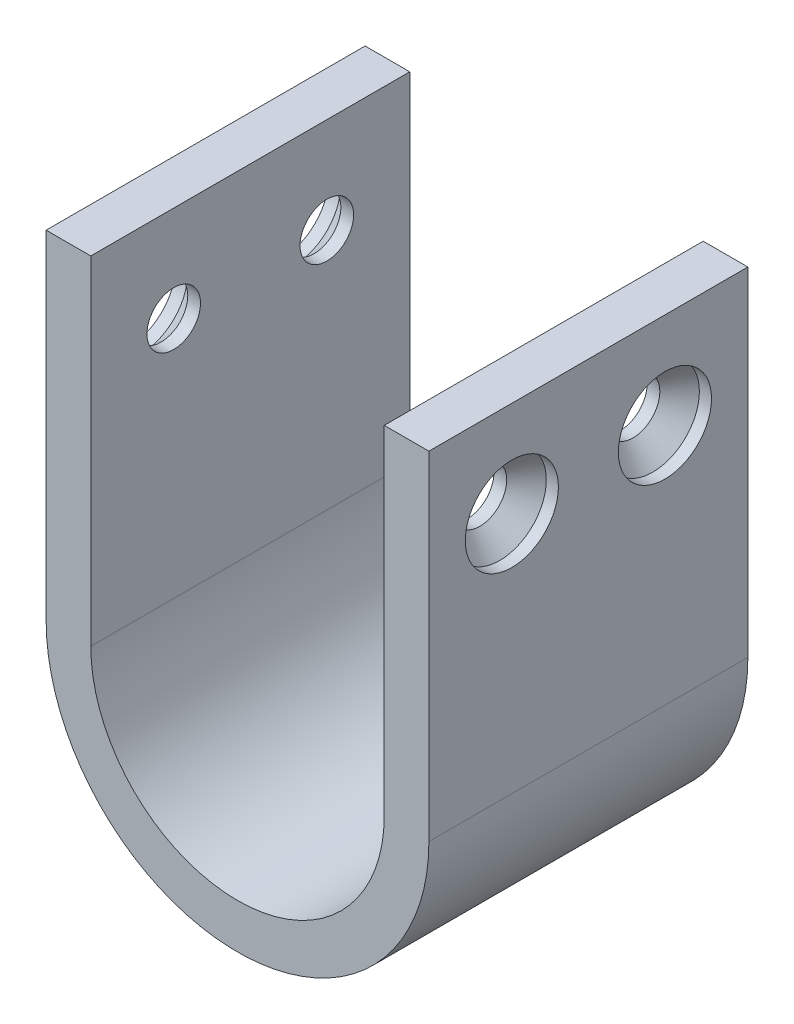
ISO-10303-21;
HEADER;
FILE_DESCRIPTION(('STEP AP214'),'2;1');
FILE_NAME('part.step','',(''),(''),'','','');
FILE_SCHEMA(('AUTOMOTIVE_DESIGN { 1 0 10303 214 1 1 1 1 }'));
ENDSEC;
DATA;
#1=APPLICATION_CONTEXT('core data for automotive mechanical design processes');
#2=APPLICATION_PROTOCOL_DEFINITION('international standard','automotive_design',2000,#1);
#3=PRODUCT_CONTEXT('',#1,'mechanical');
#4=PRODUCT('Part','Part','',(#3));
#5=PRODUCT_RELATED_PRODUCT_CATEGORY('part','',(#4));
#6=PRODUCT_DEFINITION_FORMATION('','',#4);
#7=PRODUCT_DEFINITION_CONTEXT('part definition',#1,'design');
#8=PRODUCT_DEFINITION('design','',#6,#7);
#9=PRODUCT_DEFINITION_SHAPE('','',#8);
#10=(LENGTH_UNIT() NAMED_UNIT(*) SI_UNIT(.MILLI.,.METRE.));
#11=(NAMED_UNIT(*) PLANE_ANGLE_UNIT() SI_UNIT($,.RADIAN.));
#12=(NAMED_UNIT(*) SI_UNIT($,.STERADIAN.) SOLID_ANGLE_UNIT());
#13=UNCERTAINTY_MEASURE_WITH_UNIT(LENGTH_MEASURE(1.E-05),#10,'distance_accuracy_value','');
#14=(GEOMETRIC_REPRESENTATION_CONTEXT(3) GLOBAL_UNCERTAINTY_ASSIGNED_CONTEXT((#13)) GLOBAL_UNIT_ASSIGNED_CONTEXT((#10,
#11,#12)) REPRESENTATION_CONTEXT('',''));
#15=CARTESIAN_POINT('',(0.,0.,0.));
#16=DIRECTION('',(0.,0.,1.));
#17=DIRECTION('',(1.,0.,0.));
#18=AXIS2_PLACEMENT_3D('',#15,#16,#17);
#19=CARTESIAN_POINT('',(15.,0.,25.));
#20=DIRECTION('',(-1.,0.,0.));
#21=DIRECTION('',(0.,-1.,0.));
#22=AXIS2_PLACEMENT_3D('',#19,#20,#21);
#23=PLANE('',#22);
#24=CARTESIAN_POINT('',(15.,19.,18.5));
#25=DIRECTION('',(-1.,0.,0.));
#26=DIRECTION('',(0.,0.,-1.));
#27=AXIS2_PLACEMENT_3D('',#24,#25,#26);
#28=CIRCLE('',#27,3.65);
#29=CARTESIAN_POINT('',(15.,19.,14.85));
#30=VERTEX_POINT('',#29);
#31=EDGE_CURVE('E300',#30,#30,#28,.T.);
#32=ORIENTED_EDGE('',*,*,#31,.T.);
#33=EDGE_LOOP('',(#32));
#34=FACE_BOUND('',#33,.T.);
#35=DIRECTION('',(0.,1.,0.));
#36=VECTOR('',#35,1.);
#37=CARTESIAN_POINT('',(15.,0.,0.));
#38=LINE('',#37,#36);
#39=CARTESIAN_POINT('',(15.,0.,0.));
#40=VERTEX_POINT('',#39);
#41=CARTESIAN_POINT('',(15.,26.5,0.));
#42=VERTEX_POINT('',#41);
#43=EDGE_CURVE('E127',#40,#42,#38,.T.);
#44=ORIENTED_EDGE('',*,*,#43,.T.);
#45=DIRECTION('',(0.,0.,-1.));
#46=VECTOR('',#45,1.);
#47=CARTESIAN_POINT('',(15.,26.5,25.));
#48=LINE('',#47,#46);
#49=CARTESIAN_POINT('',(15.,26.5,25.));
#50=VERTEX_POINT('',#49);
#51=EDGE_CURVE('E124',#50,#42,#48,.T.);
#52=ORIENTED_EDGE('',*,*,#51,.F.);
#53=DIRECTION('',(0.,1.,0.));
#54=VECTOR('',#53,1.);
#55=CARTESIAN_POINT('',(15.,0.,25.));
#56=LINE('',#55,#54);
#57=CARTESIAN_POINT('',(15.,0.,25.));
#58=VERTEX_POINT('',#57);
#59=EDGE_CURVE('E113',#58,#50,#56,.T.);
#60=ORIENTED_EDGE('',*,*,#59,.F.);
#61=DIRECTION('',(0.,0.,-1.));
#62=VECTOR('',#61,1.);
#63=CARTESIAN_POINT('',(15.,0.,25.));
#64=LINE('',#63,#62);
#65=EDGE_CURVE('E128',#58,#40,#64,.T.);
#66=ORIENTED_EDGE('',*,*,#65,.T.);
#67=EDGE_LOOP('',(#44,#52,#60,#66));
#68=FACE_BOUND('',#67,.T.);
#69=CARTESIAN_POINT('',(15.,19.,6.5));
#70=DIRECTION('',(-1.,0.,0.));
#71=DIRECTION('',(0.,0.,1.));
#72=AXIS2_PLACEMENT_3D('',#69,#70,#71);
#73=CIRCLE('',#72,3.65);
#74=CARTESIAN_POINT('',(15.,19.,10.15));
#75=VERTEX_POINT('',#74);
#76=EDGE_CURVE('E297',#75,#75,#73,.T.);
#77=ORIENTED_EDGE('',*,*,#76,.T.);
#78=EDGE_LOOP('',(#77));
#79=FACE_BOUND('',#78,.T.);
#80=ADVANCED_FACE('F39',(#34,#68,#79),#23,.F.);
#81=CARTESIAN_POINT('',(-15.001,19.,6.5));
#82=DIRECTION('',(1.,0.,0.));
#83=DIRECTION('',(0.,0.,-1.));
#84=AXIS2_PLACEMENT_3D('',#81,#82,#83);
#85=CYLINDRICAL_SURFACE('',#84,2.1);
#86=CARTESIAN_POINT('',(12.5,19.,6.5));
#87=DIRECTION('',(1.,0.,0.));
#88=DIRECTION('',(0.,0.,-1.));
#89=AXIS2_PLACEMENT_3D('',#86,#87,#88);
#90=CIRCLE('',#89,2.1);
#91=CARTESIAN_POINT('',(12.5,19.,4.4));
#92=VERTEX_POINT('',#91);
#93=EDGE_CURVE('E182',#92,#92,#90,.T.);
#94=ORIENTED_EDGE('',*,*,#93,.T.);
#95=EDGE_LOOP('',(#94));
#96=FACE_BOUND('',#95,.T.);
#97=CARTESIAN_POINT('',(11.5,19.,6.5));
#98=DIRECTION('',(1.,0.,0.));
#99=DIRECTION('',(0.,1.,0.));
#100=AXIS2_PLACEMENT_3D('',#97,#98,#99);
#101=CIRCLE('',#100,2.1);
#102=CARTESIAN_POINT('',(11.5,21.1,6.5));
#103=VERTEX_POINT('',#102);
#104=EDGE_CURVE('E291',#103,#103,#101,.T.);
#105=ORIENTED_EDGE('',*,*,#104,.F.);
#106=EDGE_LOOP('',(#105));
#107=FACE_BOUND('',#106,.T.);
#108=ADVANCED_FACE('F203',(#96,#107),#85,.F.);
#109=CARTESIAN_POINT('',(11.5,0.,25.));
#110=DIRECTION('',(1.,0.,0.));
#111=DIRECTION('',(0.,1.,0.));
#112=AXIS2_PLACEMENT_3D('',#109,#110,#111);
#113=PLANE('',#112);
#114=CARTESIAN_POINT('',(11.5,19.,18.5));
#115=DIRECTION('',(1.,0.,0.));
#116=DIRECTION('',(0.,1.,0.));
#117=AXIS2_PLACEMENT_3D('',#114,#115,#116);
#118=CIRCLE('',#117,2.1);
#119=CARTESIAN_POINT('',(11.5,21.1,18.5));
#120=VERTEX_POINT('',#119);
#121=EDGE_CURVE('E293',#120,#120,#118,.F.);
#122=ORIENTED_EDGE('',*,*,#121,.F.);
#123=EDGE_LOOP('',(#122));
#124=FACE_BOUND('',#123,.T.);
#125=DIRECTION('',(0.,-1.,0.));
#126=VECTOR('',#125,1.);
#127=CARTESIAN_POINT('',(11.5,0.,0.));
#128=LINE('',#127,#126);
#129=CARTESIAN_POINT('',(11.5,26.5,0.));
#130=VERTEX_POINT('',#129);
#131=CARTESIAN_POINT('',(11.5,0.,0.));
#132=VERTEX_POINT('',#131);
#133=EDGE_CURVE('E91',#130,#132,#128,.T.);
#134=ORIENTED_EDGE('',*,*,#133,.T.);
#135=DIRECTION('',(0.,0.,-1.));
#136=VECTOR('',#135,1.);
#137=CARTESIAN_POINT('',(11.5,0.,25.));
#138=LINE('',#137,#136);
#139=CARTESIAN_POINT('',(11.5,0.,25.));
#140=VERTEX_POINT('',#139);
#141=EDGE_CURVE('E133',#140,#132,#138,.T.);
#142=ORIENTED_EDGE('',*,*,#141,.F.);
#143=DIRECTION('',(0.,-1.,0.));
#144=VECTOR('',#143,1.);
#145=CARTESIAN_POINT('',(11.5,0.,25.));
#146=LINE('',#145,#144);
#147=CARTESIAN_POINT('',(11.5,26.5,25.));
#148=VERTEX_POINT('',#147);
#149=EDGE_CURVE('E56',#148,#140,#146,.T.);
#150=ORIENTED_EDGE('',*,*,#149,.F.);
#151=DIRECTION('',(0.,0.,-1.));
#152=VECTOR('',#151,1.);
#153=CARTESIAN_POINT('',(11.5,26.5,25.));
#154=LINE('',#153,#152);
#155=EDGE_CURVE('E129',#148,#130,#154,.T.);
#156=ORIENTED_EDGE('',*,*,#155,.T.);
#157=EDGE_LOOP('',(#134,#142,#150,#156));
#158=FACE_BOUND('',#157,.T.);
#159=ORIENTED_EDGE('',*,*,#104,.T.);
#160=EDGE_LOOP('',(#159));
#161=FACE_BOUND('',#160,.T.);
#162=ADVANCED_FACE('F209',(#124,#158,#161),#113,.F.);
#163=CARTESIAN_POINT('',(15.001,19.,6.5));
#164=DIRECTION('',(-1.,0.,0.));
#165=DIRECTION('',(0.,0.,1.));
#166=AXIS2_PLACEMENT_3D('',#163,#164,#165);
#167=CYLINDRICAL_SURFACE('',#166,2.1);
#168=CARTESIAN_POINT('',(-12.5,19.,6.5));
#169=DIRECTION('',(-1.,0.,0.));
#170=DIRECTION('',(0.,0.,1.));
#171=AXIS2_PLACEMENT_3D('',#168,#169,#170);
#172=CIRCLE('',#171,2.1);
#173=CARTESIAN_POINT('',(-12.5,19.,8.6));
#174=VERTEX_POINT('',#173);
#175=EDGE_CURVE('E170',#174,#174,#172,.T.);
#176=ORIENTED_EDGE('',*,*,#175,.T.);
#177=EDGE_LOOP('',(#176));
#178=FACE_BOUND('',#177,.T.);
#179=CARTESIAN_POINT('',(-11.5,19.,6.5));
#180=DIRECTION('',(-1.,0.,0.));
#181=DIRECTION('',(0.,0.,1.));
#182=AXIS2_PLACEMENT_3D('',#179,#180,#181);
#183=CIRCLE('',#182,2.1);
#184=CARTESIAN_POINT('',(-11.5,19.,8.6));
#185=VERTEX_POINT('',#184);
#186=EDGE_CURVE('E141',#185,#185,#183,.F.);
#187=ORIENTED_EDGE('',*,*,#186,.T.);
#188=EDGE_LOOP('',(#187));
#189=FACE_BOUND('',#188,.T.);
#190=ADVANCED_FACE('F232',(#178,#189),#167,.F.);
#191=CARTESIAN_POINT('',(-11.5,0.,25.));
#192=DIRECTION('',(-1.,0.,0.));
#193=DIRECTION('',(0.,0.,1.));
#194=AXIS2_PLACEMENT_3D('',#191,#192,#193);
#195=PLANE('',#194);
#196=DIRECTION('',(0.,1.,0.));
#197=VECTOR('',#196,1.);
#198=CARTESIAN_POINT('',(-11.5,0.,0.));
#199=LINE('',#198,#197);
#200=CARTESIAN_POINT('',(-11.5,0.,0.));
#201=VERTEX_POINT('',#200);
#202=CARTESIAN_POINT('',(-11.5,26.5,0.));
#203=VERTEX_POINT('',#202);
#204=EDGE_CURVE('E140',#201,#203,#199,.T.);
#205=ORIENTED_EDGE('',*,*,#204,.T.);
#206=DIRECTION('',(0.,0.,-1.));
#207=VECTOR('',#206,1.);
#208=CARTESIAN_POINT('',(-11.5,26.5,25.));
#209=LINE('',#208,#207);
#210=CARTESIAN_POINT('',(-11.5,26.5,25.));
#211=VERTEX_POINT('',#210);
#212=EDGE_CURVE('E162',#211,#203,#209,.T.);
#213=ORIENTED_EDGE('',*,*,#212,.F.);
#214=DIRECTION('',(0.,1.,0.));
#215=VECTOR('',#214,1.);
#216=CARTESIAN_POINT('',(-11.5,0.,25.));
#217=LINE('',#216,#215);
#218=CARTESIAN_POINT('',(-11.5,0.,25.));
#219=VERTEX_POINT('',#218);
#220=EDGE_CURVE('E100',#219,#211,#217,.T.);
#221=ORIENTED_EDGE('',*,*,#220,.F.);
#222=DIRECTION('',(0.,0.,-1.));
#223=VECTOR('',#222,1.);
#224=CARTESIAN_POINT('',(-11.5,0.,25.));
#225=LINE('',#224,#223);
#226=EDGE_CURVE('E165',#219,#201,#225,.T.);
#227=ORIENTED_EDGE('',*,*,#226,.T.);
#228=EDGE_LOOP('',(#205,#213,#221,#227));
#229=FACE_BOUND('',#228,.T.);
#230=CARTESIAN_POINT('',(-11.5,19.,18.5));
#231=DIRECTION('',(-1.,0.,0.));
#232=DIRECTION('',(0.,0.,1.));
#233=AXIS2_PLACEMENT_3D('',#230,#231,#232);
#234=CIRCLE('',#233,2.1);
#235=CARTESIAN_POINT('',(-11.5,19.,20.6));
#236=VERTEX_POINT('',#235);
#237=EDGE_CURVE('E259',#236,#236,#234,.T.);
#238=ORIENTED_EDGE('',*,*,#237,.T.);
#239=EDGE_LOOP('',(#238));
#240=FACE_BOUND('',#239,.T.);
#241=ORIENTED_EDGE('',*,*,#186,.F.);
#242=EDGE_LOOP('',(#241));
#243=FACE_BOUND('',#242,.T.);
#244=ADVANCED_FACE('F225',(#229,#240,#243),#195,.F.);
#245=CARTESIAN_POINT('',(-15.,0.,25.));
#246=DIRECTION('',(1.,0.,0.));
#247=DIRECTION('',(0.,0.,-1.));
#248=AXIS2_PLACEMENT_3D('',#245,#246,#247);
#249=PLANE('',#248);
#250=CARTESIAN_POINT('',(-15.,19.,6.5));
#251=DIRECTION('',(-1.,0.,0.));
#252=DIRECTION('',(0.,0.,1.));
#253=AXIS2_PLACEMENT_3D('',#250,#251,#252);
#254=CIRCLE('',#253,3.65);
#255=CARTESIAN_POINT('',(-15.,19.,10.15));
#256=VERTEX_POINT('',#255);
#257=EDGE_CURVE('E262',#256,#256,#254,.T.);
#258=ORIENTED_EDGE('',*,*,#257,.F.);
#259=EDGE_LOOP('',(#258));
#260=FACE_BOUND('',#259,.T.);
#261=CARTESIAN_POINT('',(-15.,19.,18.5));
#262=DIRECTION('',(-1.,0.,0.));
#263=DIRECTION('',(0.,0.,-1.));
#264=AXIS2_PLACEMENT_3D('',#261,#262,#263);
#265=CIRCLE('',#264,3.65);
#266=CARTESIAN_POINT('',(-15.,19.,14.85));
#267=VERTEX_POINT('',#266);
#268=EDGE_CURVE('E265',#267,#267,#265,.T.);
#269=ORIENTED_EDGE('',*,*,#268,.F.);
#270=EDGE_LOOP('',(#269));
#271=FACE_BOUND('',#270,.T.);
#272=DIRECTION('',(0.,-1.,0.));
#273=VECTOR('',#272,1.);
#274=CARTESIAN_POINT('',(-15.,0.,0.));
#275=LINE('',#274,#273);
#276=CARTESIAN_POINT('',(-15.,26.5,0.));
#277=VERTEX_POINT('',#276);
#278=CARTESIAN_POINT('',(-15.,0.,0.));
#279=VERTEX_POINT('',#278);
#280=EDGE_CURVE('E145',#277,#279,#275,.T.);
#281=ORIENTED_EDGE('',*,*,#280,.T.);
#282=DIRECTION('',(0.,0.,-1.));
#283=VECTOR('',#282,1.);
#284=CARTESIAN_POINT('',(-15.,0.,25.));
#285=LINE('',#284,#283);
#286=CARTESIAN_POINT('',(-15.,0.,25.));
#287=VERTEX_POINT('',#286);
#288=EDGE_CURVE('E156',#287,#279,#285,.T.);
#289=ORIENTED_EDGE('',*,*,#288,.F.);
#290=DIRECTION('',(0.,-1.,0.));
#291=VECTOR('',#290,1.);
#292=CARTESIAN_POINT('',(-15.,0.,25.));
#293=LINE('',#292,#291);
#294=CARTESIAN_POINT('',(-15.,26.5,25.));
#295=VERTEX_POINT('',#294);
#296=EDGE_CURVE('E272',#295,#287,#293,.T.);
#297=ORIENTED_EDGE('',*,*,#296,.F.);
#298=DIRECTION('',(0.,0.,-1.));
#299=VECTOR('',#298,1.);
#300=CARTESIAN_POINT('',(-15.,26.5,25.));
#301=LINE('',#300,#299);
#302=EDGE_CURVE('E159',#295,#277,#301,.T.);
#303=ORIENTED_EDGE('',*,*,#302,.T.);
#304=EDGE_LOOP('',(#281,#289,#297,#303));
#305=FACE_BOUND('',#304,.T.);
#306=ADVANCED_FACE('F221',(#260,#271,#305),#249,.F.);
#307=CARTESIAN_POINT('',(0.,0.,25.));
#308=DIRECTION('',(0.,0.,-1.));
#309=DIRECTION('',(-1.,0.,0.));
#310=AXIS2_PLACEMENT_3D('',#307,#308,#309);
#311=CYLINDRICAL_SURFACE('',#310,11.5);
#312=CARTESIAN_POINT('',(0.,0.,0.));
#313=DIRECTION('',(0.,0.,-1.));
#314=DIRECTION('',(1.,0.,0.));
#315=AXIS2_PLACEMENT_3D('',#312,#313,#314);
#316=CIRCLE('',#315,11.5);
#317=EDGE_CURVE('E137',#132,#201,#316,.T.);
#318=ORIENTED_EDGE('',*,*,#317,.T.);
#319=ORIENTED_EDGE('',*,*,#226,.F.);
#320=CARTESIAN_POINT('',(0.,0.,25.));
#321=DIRECTION('',(0.,0.,-1.));
#322=DIRECTION('',(1.,0.,0.));
#323=AXIS2_PLACEMENT_3D('',#320,#321,#322);
#324=CIRCLE('',#323,11.5);
#325=EDGE_CURVE('E152',#140,#219,#324,.T.);
#326=ORIENTED_EDGE('',*,*,#325,.F.);
#327=ORIENTED_EDGE('',*,*,#141,.T.);
#328=EDGE_LOOP('',(#318,#319,#326,#327));
#329=FACE_BOUND('',#328,.T.);
#330=ADVANCED_FACE('F224',(#329),#311,.F.);
#331=CARTESIAN_POINT('',(-15.,26.5,25.));
#332=DIRECTION('',(0.,-1.,0.));
#333=DIRECTION('',(0.,0.,-1.));
#334=AXIS2_PLACEMENT_3D('',#331,#332,#333);
#335=PLANE('',#334);
#336=DIRECTION('',(-1.,0.,0.));
#337=VECTOR('',#336,1.);
#338=CARTESIAN_POINT('',(-15.,26.5,0.));
#339=LINE('',#338,#337);
#340=EDGE_CURVE('E143',#203,#277,#339,.T.);
#341=ORIENTED_EDGE('',*,*,#340,.T.);
#342=ORIENTED_EDGE('',*,*,#302,.F.);
#343=DIRECTION('',(-1.,0.,0.));
#344=VECTOR('',#343,1.);
#345=CARTESIAN_POINT('',(-15.,26.5,25.));
#346=LINE('',#345,#344);
#347=EDGE_CURVE('E270',#211,#295,#346,.T.);
#348=ORIENTED_EDGE('',*,*,#347,.F.);
#349=ORIENTED_EDGE('',*,*,#212,.T.);
#350=EDGE_LOOP('',(#341,#342,#348,#349));
#351=FACE_BOUND('',#350,.T.);
#352=ADVANCED_FACE('F219',(#351),#335,.F.);
#353=CARTESIAN_POINT('',(0.,0.,25.));
#354=DIRECTION('',(0.,0.,-1.));
#355=DIRECTION('',(-1.,0.,0.));
#356=AXIS2_PLACEMENT_3D('',#353,#354,#355);
#357=CYLINDRICAL_SURFACE('',#356,15.);
#358=CARTESIAN_POINT('',(0.,0.,0.));
#359=DIRECTION('',(0.,0.,1.));
#360=DIRECTION('',(1.,0.,0.));
#361=AXIS2_PLACEMENT_3D('',#358,#359,#360);
#362=CIRCLE('',#361,15.);
#363=EDGE_CURVE('E147',#279,#40,#362,.T.);
#364=ORIENTED_EDGE('',*,*,#363,.T.);
#365=ORIENTED_EDGE('',*,*,#65,.F.);
#366=CARTESIAN_POINT('',(0.,0.,25.));
#367=DIRECTION('',(0.,0.,1.));
#368=DIRECTION('',(1.,0.,0.));
#369=AXIS2_PLACEMENT_3D('',#366,#367,#368);
#370=CIRCLE('',#369,15.);
#371=EDGE_CURVE('E119',#287,#58,#370,.T.);
#372=ORIENTED_EDGE('',*,*,#371,.F.);
#373=ORIENTED_EDGE('',*,*,#288,.T.);
#374=EDGE_LOOP('',(#364,#365,#372,#373));
#375=FACE_BOUND('',#374,.T.);
#376=ADVANCED_FACE('F216',(#375),#357,.T.);
#377=CARTESIAN_POINT('',(15.,26.5,25.));
#378=DIRECTION('',(0.,-1.,0.));
#379=DIRECTION('',(1.,0.,0.));
#380=AXIS2_PLACEMENT_3D('',#377,#378,#379);
#381=PLANE('',#380);
#382=DIRECTION('',(-1.,0.,0.));
#383=VECTOR('',#382,1.);
#384=CARTESIAN_POINT('',(15.,26.5,0.));
#385=LINE('',#384,#383);
#386=EDGE_CURVE('E85',#42,#130,#385,.T.);
#387=ORIENTED_EDGE('',*,*,#386,.T.);
#388=ORIENTED_EDGE('',*,*,#155,.F.);
#389=DIRECTION('',(-1.,0.,0.));
#390=VECTOR('',#389,1.);
#391=CARTESIAN_POINT('',(15.,26.5,25.));
#392=LINE('',#391,#390);
#393=EDGE_CURVE('E117',#50,#148,#392,.T.);
#394=ORIENTED_EDGE('',*,*,#393,.F.);
#395=ORIENTED_EDGE('',*,*,#51,.T.);
#396=EDGE_LOOP('',(#387,#388,#394,#395));
#397=FACE_BOUND('',#396,.T.);
#398=ADVANCED_FACE('F131',(#397),#381,.F.);
#399=CARTESIAN_POINT('',(0.,0.,25.));
#400=DIRECTION('',(0.,0.,1.));
#401=DIRECTION('',(1.,0.,0.));
#402=AXIS2_PLACEMENT_3D('',#399,#400,#401);
#403=PLANE('',#402);
#404=ORIENTED_EDGE('',*,*,#325,.T.);
#405=ORIENTED_EDGE('',*,*,#220,.T.);
#406=ORIENTED_EDGE('',*,*,#347,.T.);
#407=ORIENTED_EDGE('',*,*,#296,.T.);
#408=ORIENTED_EDGE('',*,*,#371,.T.);
#409=ORIENTED_EDGE('',*,*,#59,.T.);
#410=ORIENTED_EDGE('',*,*,#393,.T.);
#411=ORIENTED_EDGE('',*,*,#149,.T.);
#412=EDGE_LOOP('',(#404,#405,#406,#407,#408,#409,#410,#411));
#413=FACE_BOUND('',#412,.T.);
#414=ADVANCED_FACE('F115',(#413),#403,.T.);
#415=CARTESIAN_POINT('',(0.,0.,0.));
#416=DIRECTION('',(0.,0.,1.));
#417=DIRECTION('',(1.,0.,0.));
#418=AXIS2_PLACEMENT_3D('',#415,#416,#417);
#419=PLANE('',#418);
#420=ORIENTED_EDGE('',*,*,#317,.F.);
#421=ORIENTED_EDGE('',*,*,#133,.F.);
#422=ORIENTED_EDGE('',*,*,#386,.F.);
#423=ORIENTED_EDGE('',*,*,#43,.F.);
#424=ORIENTED_EDGE('',*,*,#363,.F.);
#425=ORIENTED_EDGE('',*,*,#280,.F.);
#426=ORIENTED_EDGE('',*,*,#340,.F.);
#427=ORIENTED_EDGE('',*,*,#204,.F.);
#428=EDGE_LOOP('',(#420,#421,#422,#423,#424,#425,#426,#427));
#429=FACE_BOUND('',#428,.T.);
#430=ADVANCED_FACE('F282',(#429),#419,.F.);
#431=CARTESIAN_POINT('',(15.001,19.,18.5));
#432=DIRECTION('',(-1.,0.,0.));
#433=DIRECTION('',(0.,0.,1.));
#434=AXIS2_PLACEMENT_3D('',#431,#432,#433);
#435=CYLINDRICAL_SURFACE('',#434,2.1);
#436=CARTESIAN_POINT('',(-12.5,19.,18.5));
#437=DIRECTION('',(1.,0.,0.));
#438=DIRECTION('',(0.,0.,-1.));
#439=AXIS2_PLACEMENT_3D('',#436,#437,#438);
#440=CIRCLE('',#439,2.1);
#441=CARTESIAN_POINT('',(-12.5,19.,16.4));
#442=VERTEX_POINT('',#441);
#443=EDGE_CURVE('E167',#442,#442,#440,.F.);
#444=ORIENTED_EDGE('',*,*,#443,.T.);
#445=EDGE_LOOP('',(#444));
#446=FACE_BOUND('',#445,.T.);
#447=ORIENTED_EDGE('',*,*,#237,.F.);
#448=EDGE_LOOP('',(#447));
#449=FACE_BOUND('',#448,.T.);
#450=ADVANCED_FACE('F315',(#446,#449),#435,.F.);
#451=CARTESIAN_POINT('',(-14.5,19.,6.5));
#452=DIRECTION('',(-1.,0.,0.));
#453=DIRECTION('',(0.,0.,1.));
#454=AXIS2_PLACEMENT_3D('',#451,#452,#453);
#455=CYLINDRICAL_SURFACE('',#454,3.65);
#456=CARTESIAN_POINT('',(-14.05,19.,6.5));
#457=DIRECTION('',(-1.,0.,0.));
#458=DIRECTION('',(0.,0.,1.));
#459=AXIS2_PLACEMENT_3D('',#456,#457,#458);
#460=CIRCLE('',#459,3.65);
#461=CARTESIAN_POINT('',(-14.05,19.,10.15));
#462=VERTEX_POINT('',#461);
#463=EDGE_CURVE('E176',#462,#462,#460,.F.);
#464=ORIENTED_EDGE('',*,*,#463,.T.);
#465=EDGE_LOOP('',(#464));
#466=FACE_BOUND('',#465,.T.);
#467=ORIENTED_EDGE('',*,*,#257,.T.);
#468=EDGE_LOOP('',(#467));
#469=FACE_BOUND('',#468,.T.);
#470=ADVANCED_FACE('F305',(#466,#469),#455,.F.);
#471=CARTESIAN_POINT('',(-14.5,19.,18.5));
#472=DIRECTION('',(-1.,0.,0.));
#473=DIRECTION('',(0.,0.,1.));
#474=AXIS2_PLACEMENT_3D('',#471,#472,#473);
#475=CYLINDRICAL_SURFACE('',#474,3.65);
#476=CARTESIAN_POINT('',(-14.05,19.,18.5));
#477=DIRECTION('',(-1.,0.,0.));
#478=DIRECTION('',(0.,0.,1.));
#479=AXIS2_PLACEMENT_3D('',#476,#477,#478);
#480=CIRCLE('',#479,3.65);
#481=CARTESIAN_POINT('',(-14.05,19.,22.15));
#482=VERTEX_POINT('',#481);
#483=EDGE_CURVE('E173',#482,#482,#480,.F.);
#484=ORIENTED_EDGE('',*,*,#483,.T.);
#485=EDGE_LOOP('',(#484));
#486=FACE_BOUND('',#485,.T.);
#487=ORIENTED_EDGE('',*,*,#268,.T.);
#488=EDGE_LOOP('',(#487));
#489=FACE_BOUND('',#488,.T.);
#490=ADVANCED_FACE('F239',(#486,#489),#475,.F.);
#491=CARTESIAN_POINT('',(-12.5,19.,18.5));
#492=DIRECTION('',(-1.,0.,0.));
#493=DIRECTION('',(0.,0.,1.));
#494=AXIS2_PLACEMENT_3D('',#491,#492,#493);
#495=CONICAL_SURFACE('',#494,2.1,0.785398163397443);
#496=ORIENTED_EDGE('',*,*,#483,.F.);
#497=EDGE_LOOP('',(#496));
#498=FACE_BOUND('',#497,.T.);
#499=ORIENTED_EDGE('',*,*,#443,.F.);
#500=EDGE_LOOP('',(#499));
#501=FACE_BOUND('',#500,.T.);
#502=ADVANCED_FACE('F236',(#498,#501),#495,.F.);
#503=CARTESIAN_POINT('',(-12.5,19.,6.5));
#504=DIRECTION('',(-1.,0.,0.));
#505=DIRECTION('',(0.,0.,1.));
#506=AXIS2_PLACEMENT_3D('',#503,#504,#505);
#507=CONICAL_SURFACE('',#506,2.1,0.785398163397443);
#508=ORIENTED_EDGE('',*,*,#463,.F.);
#509=EDGE_LOOP('',(#508));
#510=FACE_BOUND('',#509,.T.);
#511=ORIENTED_EDGE('',*,*,#175,.F.);
#512=EDGE_LOOP('',(#511));
#513=FACE_BOUND('',#512,.T.);
#514=ADVANCED_FACE('F238',(#510,#513),#507,.F.);
#515=CARTESIAN_POINT('',(-15.001,19.,18.5));
#516=DIRECTION('',(1.,0.,0.));
#517=DIRECTION('',(0.,0.,-1.));
#518=AXIS2_PLACEMENT_3D('',#515,#516,#517);
#519=CYLINDRICAL_SURFACE('',#518,2.1);
#520=CARTESIAN_POINT('',(12.5,19.,18.5));
#521=DIRECTION('',(-1.,0.,0.));
#522=DIRECTION('',(0.,0.,1.));
#523=AXIS2_PLACEMENT_3D('',#520,#521,#522);
#524=CIRCLE('',#523,2.1);
#525=CARTESIAN_POINT('',(12.5,19.,20.6));
#526=VERTEX_POINT('',#525);
#527=EDGE_CURVE('E179',#526,#526,#524,.F.);
#528=ORIENTED_EDGE('',*,*,#527,.T.);
#529=EDGE_LOOP('',(#528));
#530=FACE_BOUND('',#529,.T.);
#531=ORIENTED_EDGE('',*,*,#121,.T.);
#532=EDGE_LOOP('',(#531));
#533=FACE_BOUND('',#532,.T.);
#534=ADVANCED_FACE('F242',(#530,#533),#519,.F.);
#535=CARTESIAN_POINT('',(14.5,19.,6.5));
#536=DIRECTION('',(1.,0.,0.));
#537=DIRECTION('',(0.,0.,-1.));
#538=AXIS2_PLACEMENT_3D('',#535,#536,#537);
#539=CYLINDRICAL_SURFACE('',#538,3.65);
#540=CARTESIAN_POINT('',(14.05,19.,6.5));
#541=DIRECTION('',(1.,0.,0.));
#542=DIRECTION('',(0.,0.,-1.));
#543=AXIS2_PLACEMENT_3D('',#540,#541,#542);
#544=CIRCLE('',#543,3.65);
#545=CARTESIAN_POINT('',(14.05,19.,2.85));
#546=VERTEX_POINT('',#545);
#547=EDGE_CURVE('E11',#546,#546,#544,.F.);
#548=ORIENTED_EDGE('',*,*,#547,.T.);
#549=EDGE_LOOP('',(#548));
#550=FACE_BOUND('',#549,.T.);
#551=ORIENTED_EDGE('',*,*,#76,.F.);
#552=EDGE_LOOP('',(#551));
#553=FACE_BOUND('',#552,.T.);
#554=ADVANCED_FACE('F198',(#550,#553),#539,.F.);
#555=CARTESIAN_POINT('',(14.5,19.,18.5));
#556=DIRECTION('',(1.,0.,0.));
#557=DIRECTION('',(0.,0.,-1.));
#558=AXIS2_PLACEMENT_3D('',#555,#556,#557);
#559=CYLINDRICAL_SURFACE('',#558,3.65);
#560=CARTESIAN_POINT('',(14.05,19.,18.5));
#561=DIRECTION('',(1.,0.,0.));
#562=DIRECTION('',(0.,0.,-1.));
#563=AXIS2_PLACEMENT_3D('',#560,#561,#562);
#564=CIRCLE('',#563,3.65);
#565=CARTESIAN_POINT('',(14.05,19.,14.85));
#566=VERTEX_POINT('',#565);
#567=EDGE_CURVE('E48',#566,#566,#564,.F.);
#568=ORIENTED_EDGE('',*,*,#567,.T.);
#569=EDGE_LOOP('',(#568));
#570=FACE_BOUND('',#569,.T.);
#571=ORIENTED_EDGE('',*,*,#31,.F.);
#572=EDGE_LOOP('',(#571));
#573=FACE_BOUND('',#572,.T.);
#574=ADVANCED_FACE('F187',(#570,#573),#559,.F.);
#575=CARTESIAN_POINT('',(14.5,19.,18.5));
#576=DIRECTION('',(1.,0.,0.));
#577=DIRECTION('',(0.,0.,-1.));
#578=AXIS2_PLACEMENT_3D('',#575,#576,#577);
#579=CONICAL_SURFACE('',#578,4.10000000000004,0.785398163397453);
#580=ORIENTED_EDGE('',*,*,#527,.F.);
#581=EDGE_LOOP('',(#580));
#582=FACE_BOUND('',#581,.T.);
#583=ORIENTED_EDGE('',*,*,#567,.F.);
#584=EDGE_LOOP('',(#583));
#585=FACE_BOUND('',#584,.T.);
#586=ADVANCED_FACE('F190',(#582,#585),#579,.F.);
#587=CARTESIAN_POINT('',(14.5,19.,6.5));
#588=DIRECTION('',(1.,0.,0.));
#589=DIRECTION('',(0.,0.,-1.));
#590=AXIS2_PLACEMENT_3D('',#587,#588,#589);
#591=CONICAL_SURFACE('',#590,4.10000000000004,0.785398163397453);
#592=ORIENTED_EDGE('',*,*,#93,.F.);
#593=EDGE_LOOP('',(#592));
#594=FACE_BOUND('',#593,.T.);
#595=ORIENTED_EDGE('',*,*,#547,.F.);
#596=EDGE_LOOP('',(#595));
#597=FACE_BOUND('',#596,.T.);
#598=ADVANCED_FACE('F41',(#594,#597),#591,.F.);
#599=CLOSED_SHELL('',(#80,#108,#162,#190,#244,#306,#330,#352,#376,#398,#414,#430,#450,#470,#490,
#502,#514,#534,#554,#574,#586,#598));
#600=MANIFOLD_SOLID_BREP('B2',#599);
#601=ADVANCED_BREP_SHAPE_REPRESENTATION('',(#18,#600),#14);
#602=SHAPE_DEFINITION_REPRESENTATION(#9,#601);
ENDSEC;
END-ISO-10303-21;
